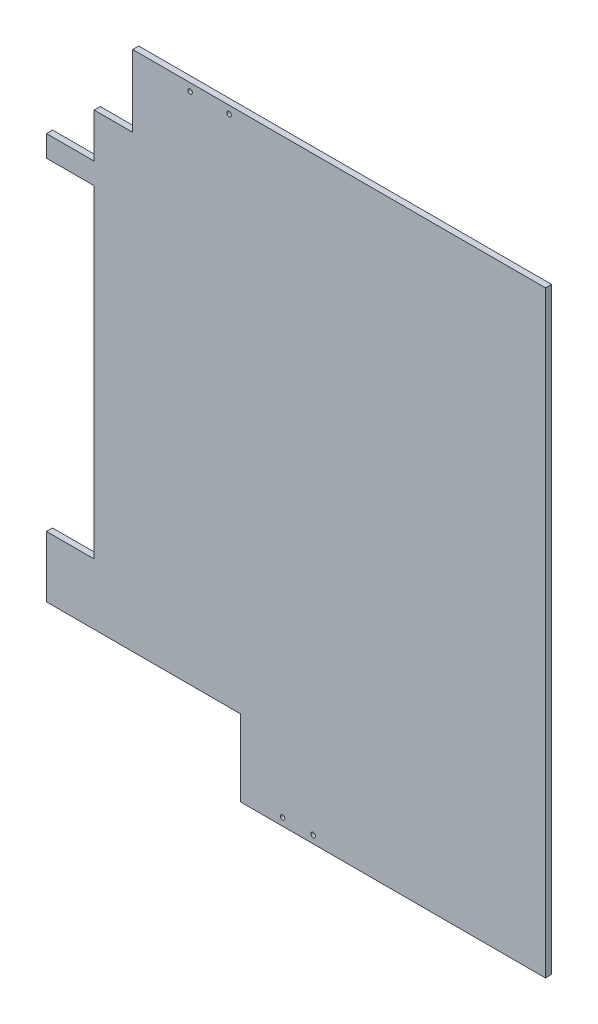
ISO-10303-21;
HEADER;
FILE_DESCRIPTION(('STEP AP214'),'2;1');
FILE_NAME('part.step','',(''),(''),'','','');
FILE_SCHEMA(('AUTOMOTIVE_DESIGN { 1 0 10303 214 1 1 1 1 }'));
ENDSEC;
DATA;
#1=APPLICATION_CONTEXT('core data for automotive mechanical design processes');
#2=APPLICATION_PROTOCOL_DEFINITION('international standard','automotive_design',2000,#1);
#3=PRODUCT_CONTEXT('',#1,'mechanical');
#4=PRODUCT('Part','Part','',(#3));
#5=PRODUCT_RELATED_PRODUCT_CATEGORY('part','',(#4));
#6=PRODUCT_DEFINITION_FORMATION('','',#4);
#7=PRODUCT_DEFINITION_CONTEXT('part definition',#1,'design');
#8=PRODUCT_DEFINITION('design','',#6,#7);
#9=PRODUCT_DEFINITION_SHAPE('','',#8);
#10=(LENGTH_UNIT() NAMED_UNIT(*) SI_UNIT(.MILLI.,.METRE.));
#11=(NAMED_UNIT(*) PLANE_ANGLE_UNIT() SI_UNIT($,.RADIAN.));
#12=(NAMED_UNIT(*) SI_UNIT($,.STERADIAN.) SOLID_ANGLE_UNIT());
#13=UNCERTAINTY_MEASURE_WITH_UNIT(LENGTH_MEASURE(1.E-05),#10,'distance_accuracy_value','');
#14=(GEOMETRIC_REPRESENTATION_CONTEXT(3) GLOBAL_UNCERTAINTY_ASSIGNED_CONTEXT((#13)) GLOBAL_UNIT_ASSIGNED_CONTEXT((#10,
#11,#12)) REPRESENTATION_CONTEXT('',''));
#15=CARTESIAN_POINT('',(0.,0.,0.));
#16=DIRECTION('',(0.,0.,1.));
#17=DIRECTION('',(1.,0.,0.));
#18=AXIS2_PLACEMENT_3D('',#15,#16,#17);
#19=CARTESIAN_POINT('',(0.,30.0000000000002,4.));
#20=DIRECTION('',(0.,1.,0.));
#21=DIRECTION('',(0.,0.,1.));
#22=AXIS2_PLACEMENT_3D('',#19,#20,#21);
#23=PLANE('',#22);
#24=DIRECTION('',(1.,0.,0.));
#25=VECTOR('',#24,1.);
#26=CARTESIAN_POINT('',(0.,30.0000000000002,0.));
#27=LINE('',#26,#25);
#28=CARTESIAN_POINT('',(25.5000000000002,30.0000000000002,0.));
#29=VERTEX_POINT('',#28);
#30=CARTESIAN_POINT('',(50.7481178591723,30.0000000000002,0.));
#31=VERTEX_POINT('',#30);
#32=EDGE_CURVE('E163',#29,#31,#27,.T.);
#33=ORIENTED_EDGE('',*,*,#32,.F.);
#34=DIRECTION('',(0.,0.,-1.));
#35=VECTOR('',#34,1.);
#36=CARTESIAN_POINT('',(25.5000000000002,30.0000000000002,4.));
#37=LINE('',#36,#35);
#38=CARTESIAN_POINT('',(25.5000000000002,30.0000000000002,4.));
#39=VERTEX_POINT('',#38);
#40=EDGE_CURVE('E11',#39,#29,#37,.T.);
#41=ORIENTED_EDGE('',*,*,#40,.F.);
#42=DIRECTION('',(1.,0.,0.));
#43=VECTOR('',#42,1.);
#44=CARTESIAN_POINT('',(0.,30.0000000000002,4.));
#45=LINE('',#44,#43);
#46=CARTESIAN_POINT('',(50.7481178591723,30.0000000000002,4.));
#47=VERTEX_POINT('',#46);
#48=EDGE_CURVE('E198',#39,#47,#45,.T.);
#49=ORIENTED_EDGE('',*,*,#48,.T.);
#50=DIRECTION('',(0.,0.,-1.));
#51=VECTOR('',#50,1.);
#52=CARTESIAN_POINT('',(50.7481178591723,30.0000000000002,4.));
#53=LINE('',#52,#51);
#54=EDGE_CURVE('E51',#47,#31,#53,.T.);
#55=ORIENTED_EDGE('',*,*,#54,.T.);
#56=EDGE_LOOP('',(#33,#41,#49,#55));
#57=FACE_BOUND('',#56,.T.);
#58=ADVANCED_FACE('F35',(#57),#23,.T.);
#59=CARTESIAN_POINT('',(25.5000000000002,0.,4.));
#60=DIRECTION('',(-1.,0.,0.));
#61=DIRECTION('',(0.,0.,1.));
#62=AXIS2_PLACEMENT_3D('',#59,#60,#61);
#63=PLANE('',#62);
#64=DIRECTION('',(0.,1.,0.));
#65=VECTOR('',#64,1.);
#66=CARTESIAN_POINT('',(25.5000000000002,0.,0.));
#67=LINE('',#66,#65);
#68=CARTESIAN_POINT('',(25.5000000000002,1.00000000000458,0.));
#69=VERTEX_POINT('',#68);
#70=EDGE_CURVE('E165',#69,#29,#67,.T.);
#71=ORIENTED_EDGE('',*,*,#70,.F.);
#72=DIRECTION('',(0.,0.,-1.));
#73=VECTOR('',#72,1.);
#74=CARTESIAN_POINT('',(25.5000000000002,1.00000000000458,4.));
#75=LINE('',#74,#73);
#76=CARTESIAN_POINT('',(25.5000000000002,1.00000000000458,4.));
#77=VERTEX_POINT('',#76);
#78=EDGE_CURVE('E43',#77,#69,#75,.T.);
#79=ORIENTED_EDGE('',*,*,#78,.F.);
#80=DIRECTION('',(0.,1.,0.));
#81=VECTOR('',#80,1.);
#82=CARTESIAN_POINT('',(25.5000000000002,0.,4.));
#83=LINE('',#82,#81);
#84=EDGE_CURVE('E251',#77,#39,#83,.T.);
#85=ORIENTED_EDGE('',*,*,#84,.T.);
#86=ORIENTED_EDGE('',*,*,#40,.T.);
#87=EDGE_LOOP('',(#71,#79,#85,#86));
#88=FACE_BOUND('',#87,.T.);
#89=ADVANCED_FACE('F229',(#88),#63,.T.);
#90=CARTESIAN_POINT('',(0.,1.00000000000458,4.));
#91=DIRECTION('',(0.,1.,0.));
#92=DIRECTION('',(0.,0.,1.));
#93=AXIS2_PLACEMENT_3D('',#90,#91,#92);
#94=PLANE('',#93);
#95=DIRECTION('',(1.,0.,0.));
#96=VECTOR('',#95,1.);
#97=CARTESIAN_POINT('',(0.,1.00000000000458,0.));
#98=LINE('',#97,#96);
#99=CARTESIAN_POINT('',(-5.78229740339875,1.00000000000458,0.));
#100=VERTEX_POINT('',#99);
#101=EDGE_CURVE('E169',#100,#69,#98,.T.);
#102=ORIENTED_EDGE('',*,*,#101,.F.);
#103=DIRECTION('',(0.,0.,-1.));
#104=VECTOR('',#103,1.);
#105=CARTESIAN_POINT('',(-5.78229740339875,1.00000000000458,4.));
#106=LINE('',#105,#104);
#107=CARTESIAN_POINT('',(-5.78229740339875,1.00000000000458,4.));
#108=VERTEX_POINT('',#107);
#109=EDGE_CURVE('E218',#108,#100,#106,.T.);
#110=ORIENTED_EDGE('',*,*,#109,.F.);
#111=DIRECTION('',(1.,0.,0.));
#112=VECTOR('',#111,1.);
#113=CARTESIAN_POINT('',(0.,1.00000000000458,4.));
#114=LINE('',#113,#112);
#115=EDGE_CURVE('E225',#108,#77,#114,.T.);
#116=ORIENTED_EDGE('',*,*,#115,.T.);
#117=ORIENTED_EDGE('',*,*,#78,.T.);
#118=EDGE_LOOP('',(#102,#110,#116,#117));
#119=FACE_BOUND('',#118,.T.);
#120=ADVANCED_FACE('F223',(#119),#94,.T.);
#121=CARTESIAN_POINT('',(-5.78229740339875,0.,4.));
#122=DIRECTION('',(1.,0.,0.));
#123=DIRECTION('',(0.,1.,0.));
#124=AXIS2_PLACEMENT_3D('',#121,#122,#123);
#125=PLANE('',#124);
#126=DIRECTION('',(0.,-1.,0.));
#127=VECTOR('',#126,1.);
#128=CARTESIAN_POINT('',(-5.78229740339875,0.,0.));
#129=LINE('',#128,#127);
#130=CARTESIAN_POINT('',(-5.78229740339875,-13.,0.));
#131=VERTEX_POINT('',#130);
#132=EDGE_CURVE('E173',#100,#131,#129,.T.);
#133=ORIENTED_EDGE('',*,*,#132,.T.);
#134=DIRECTION('',(0.,0.,-1.));
#135=VECTOR('',#134,1.);
#136=CARTESIAN_POINT('',(-5.78229740339875,-13.,4.));
#137=LINE('',#136,#135);
#138=CARTESIAN_POINT('',(-5.78229740339875,-13.,4.));
#139=VERTEX_POINT('',#138);
#140=EDGE_CURVE('E215',#139,#131,#137,.T.);
#141=ORIENTED_EDGE('',*,*,#140,.F.);
#142=DIRECTION('',(0.,-1.,0.));
#143=VECTOR('',#142,1.);
#144=CARTESIAN_POINT('',(-5.78229740339875,0.,4.));
#145=LINE('',#144,#143);
#146=EDGE_CURVE('E247',#108,#139,#145,.T.);
#147=ORIENTED_EDGE('',*,*,#146,.F.);
#148=ORIENTED_EDGE('',*,*,#109,.T.);
#149=EDGE_LOOP('',(#133,#141,#147,#148));
#150=FACE_BOUND('',#149,.T.);
#151=ADVANCED_FACE('F237',(#150),#125,.F.);
#152=CARTESIAN_POINT('',(0.,-13.,4.));
#153=DIRECTION('',(0.,1.,0.));
#154=DIRECTION('',(0.,0.,1.));
#155=AXIS2_PLACEMENT_3D('',#152,#153,#154);
#156=PLANE('',#155);
#157=DIRECTION('',(1.,0.,0.));
#158=VECTOR('',#157,1.);
#159=CARTESIAN_POINT('',(0.,-13.,0.));
#160=LINE('',#159,#158);
#161=CARTESIAN_POINT('',(25.5000000000002,-13.,0.));
#162=VERTEX_POINT('',#161);
#163=EDGE_CURVE('E175',#131,#162,#160,.T.);
#164=ORIENTED_EDGE('',*,*,#163,.T.);
#165=DIRECTION('',(0.,0.,-1.));
#166=VECTOR('',#165,1.);
#167=CARTESIAN_POINT('',(25.5000000000002,-13.,4.));
#168=LINE('',#167,#166);
#169=CARTESIAN_POINT('',(25.5000000000002,-13.,4.));
#170=VERTEX_POINT('',#169);
#171=EDGE_CURVE('E213',#170,#162,#168,.T.);
#172=ORIENTED_EDGE('',*,*,#171,.F.);
#173=DIRECTION('',(1.,0.,0.));
#174=VECTOR('',#173,1.);
#175=CARTESIAN_POINT('',(0.,-13.,4.));
#176=LINE('',#175,#174);
#177=EDGE_CURVE('E243',#139,#170,#176,.T.);
#178=ORIENTED_EDGE('',*,*,#177,.F.);
#179=ORIENTED_EDGE('',*,*,#140,.T.);
#180=EDGE_LOOP('',(#164,#172,#178,#179));
#181=FACE_BOUND('',#180,.T.);
#182=ADVANCED_FACE('F241',(#181),#156,.F.);
#183=CARTESIAN_POINT('',(25.5000000000002,-225.,0.));
#184=VERTEX_POINT('',#183);
#185=EDGE_CURVE('E170',#184,#162,#67,.T.);
#186=ORIENTED_EDGE('',*,*,#185,.F.);
#187=DIRECTION('',(0.,0.,-1.));
#188=VECTOR('',#187,1.);
#189=CARTESIAN_POINT('',(25.5000000000002,-225.,4.));
#190=LINE('',#189,#188);
#191=CARTESIAN_POINT('',(25.5000000000002,-225.,4.));
#192=VERTEX_POINT('',#191);
#193=EDGE_CURVE('E211',#192,#184,#190,.T.);
#194=ORIENTED_EDGE('',*,*,#193,.F.);
#195=EDGE_CURVE('E246',#192,#170,#83,.T.);
#196=ORIENTED_EDGE('',*,*,#195,.T.);
#197=ORIENTED_EDGE('',*,*,#171,.T.);
#198=EDGE_LOOP('',(#186,#194,#196,#197));
#199=FACE_BOUND('',#198,.T.);
#200=ADVANCED_FACE('F284',(#199),#63,.T.);
#201=CARTESIAN_POINT('',(0.,-225.,4.));
#202=DIRECTION('',(0.,1.,0.));
#203=DIRECTION('',(0.,0.,1.));
#204=AXIS2_PLACEMENT_3D('',#201,#202,#203);
#205=PLANE('',#204);
#206=DIRECTION('',(1.,0.,0.));
#207=VECTOR('',#206,1.);
#208=CARTESIAN_POINT('',(0.,-225.,0.));
#209=LINE('',#208,#207);
#210=CARTESIAN_POINT('',(-5.8245592295695,-225.,0.));
#211=VERTEX_POINT('',#210);
#212=EDGE_CURVE('E178',#211,#184,#209,.T.);
#213=ORIENTED_EDGE('',*,*,#212,.F.);
#214=DIRECTION('',(0.,0.,-1.));
#215=VECTOR('',#214,1.);
#216=CARTESIAN_POINT('',(-5.8245592295695,-225.,4.));
#217=LINE('',#216,#215);
#218=CARTESIAN_POINT('',(-5.8245592295695,-225.,4.));
#219=VERTEX_POINT('',#218);
#220=EDGE_CURVE('E209',#219,#211,#217,.T.);
#221=ORIENTED_EDGE('',*,*,#220,.F.);
#222=DIRECTION('',(1.,0.,0.));
#223=VECTOR('',#222,1.);
#224=CARTESIAN_POINT('',(0.,-225.,4.));
#225=LINE('',#224,#223);
#226=EDGE_CURVE('E249',#219,#192,#225,.T.);
#227=ORIENTED_EDGE('',*,*,#226,.T.);
#228=ORIENTED_EDGE('',*,*,#193,.T.);
#229=EDGE_LOOP('',(#213,#221,#227,#228));
#230=FACE_BOUND('',#229,.T.);
#231=ADVANCED_FACE('F291',(#230),#205,.T.);
#232=CARTESIAN_POINT('',(-5.8245592295695,0.,4.));
#233=DIRECTION('',(-1.,0.,0.));
#234=DIRECTION('',(0.,0.,1.));
#235=AXIS2_PLACEMENT_3D('',#232,#233,#234);
#236=PLANE('',#235);
#237=DIRECTION('',(0.,1.,0.));
#238=VECTOR('',#237,1.);
#239=CARTESIAN_POINT('',(-5.8245592295695,0.,0.));
#240=LINE('',#239,#238);
#241=CARTESIAN_POINT('',(-5.8245592295695,-265.,0.));
#242=VERTEX_POINT('',#241);
#243=EDGE_CURVE('E181',#242,#211,#240,.T.);
#244=ORIENTED_EDGE('',*,*,#243,.F.);
#245=DIRECTION('',(0.,0.,-1.));
#246=VECTOR('',#245,1.);
#247=CARTESIAN_POINT('',(-5.8245592295695,-265.,4.));
#248=LINE('',#247,#246);
#249=CARTESIAN_POINT('',(-5.8245592295695,-265.,4.));
#250=VERTEX_POINT('',#249);
#251=EDGE_CURVE('E207',#250,#242,#248,.T.);
#252=ORIENTED_EDGE('',*,*,#251,.F.);
#253=DIRECTION('',(0.,1.,0.));
#254=VECTOR('',#253,1.);
#255=CARTESIAN_POINT('',(-5.8245592295695,0.,4.));
#256=LINE('',#255,#254);
#257=EDGE_CURVE('E257',#250,#219,#256,.T.);
#258=ORIENTED_EDGE('',*,*,#257,.T.);
#259=ORIENTED_EDGE('',*,*,#220,.T.);
#260=EDGE_LOOP('',(#244,#252,#258,#259));
#261=FACE_BOUND('',#260,.T.);
#262=ADVANCED_FACE('F297',(#261),#236,.T.);
#263=CARTESIAN_POINT('',(0.,-265.,4.));
#264=DIRECTION('',(0.,1.,0.));
#265=DIRECTION('',(0.,0.,1.));
#266=AXIS2_PLACEMENT_3D('',#263,#264,#265);
#267=PLANE('',#266);
#268=DIRECTION('',(1.,0.,0.));
#269=VECTOR('',#268,1.);
#270=CARTESIAN_POINT('',(0.,-265.,0.));
#271=LINE('',#270,#269);
#272=CARTESIAN_POINT('',(121.5,-265.,0.));
#273=VERTEX_POINT('',#272);
#274=EDGE_CURVE('E184',#242,#273,#271,.T.);
#275=ORIENTED_EDGE('',*,*,#274,.T.);
#276=DIRECTION('',(0.,0.,-1.));
#277=VECTOR('',#276,1.);
#278=CARTESIAN_POINT('',(121.5,-265.,4.));
#279=LINE('',#278,#277);
#280=CARTESIAN_POINT('',(121.5,-265.,4.));
#281=VERTEX_POINT('',#280);
#282=EDGE_CURVE('E204',#281,#273,#279,.T.);
#283=ORIENTED_EDGE('',*,*,#282,.F.);
#284=DIRECTION('',(1.,0.,0.));
#285=VECTOR('',#284,1.);
#286=CARTESIAN_POINT('',(0.,-265.,4.));
#287=LINE('',#286,#285);
#288=EDGE_CURVE('E260',#250,#281,#287,.T.);
#289=ORIENTED_EDGE('',*,*,#288,.F.);
#290=ORIENTED_EDGE('',*,*,#251,.T.);
#291=EDGE_LOOP('',(#275,#283,#289,#290));
#292=FACE_BOUND('',#291,.T.);
#293=ADVANCED_FACE('F309',(#292),#267,.F.);
#294=CARTESIAN_POINT('',(121.5,0.,4.));
#295=DIRECTION('',(1.,0.,0.));
#296=DIRECTION('',(0.,0.,-1.));
#297=AXIS2_PLACEMENT_3D('',#294,#295,#296);
#298=PLANE('',#297);
#299=DIRECTION('',(0.,-1.,0.));
#300=VECTOR('',#299,1.);
#301=CARTESIAN_POINT('',(121.5,0.,0.));
#302=LINE('',#301,#300);
#303=CARTESIAN_POINT('',(121.5,-315.,0.));
#304=VERTEX_POINT('',#303);
#305=EDGE_CURVE('E186',#273,#304,#302,.T.);
#306=ORIENTED_EDGE('',*,*,#305,.T.);
#307=DIRECTION('',(0.,0.,-1.));
#308=VECTOR('',#307,1.);
#309=CARTESIAN_POINT('',(121.5,-315.,4.));
#310=LINE('',#309,#308);
#311=CARTESIAN_POINT('',(121.5,-315.,4.));
#312=VERTEX_POINT('',#311);
#313=EDGE_CURVE('E202',#312,#304,#310,.T.);
#314=ORIENTED_EDGE('',*,*,#313,.F.);
#315=DIRECTION('',(0.,-1.,0.));
#316=VECTOR('',#315,1.);
#317=CARTESIAN_POINT('',(121.5,0.,4.));
#318=LINE('',#317,#316);
#319=EDGE_CURVE('E262',#281,#312,#318,.T.);
#320=ORIENTED_EDGE('',*,*,#319,.F.);
#321=ORIENTED_EDGE('',*,*,#282,.T.);
#322=EDGE_LOOP('',(#306,#314,#320,#321));
#323=FACE_BOUND('',#322,.T.);
#324=ADVANCED_FACE('F312',(#323),#298,.F.);
#325=CARTESIAN_POINT('',(0.,-315.,4.));
#326=DIRECTION('',(0.,-1.,0.));
#327=DIRECTION('',(0.,0.,-1.));
#328=AXIS2_PLACEMENT_3D('',#325,#326,#327);
#329=PLANE('',#328);
#330=DIRECTION('',(-1.,0.,0.));
#331=VECTOR('',#330,1.);
#332=CARTESIAN_POINT('',(0.,-315.,0.));
#333=LINE('',#332,#331);
#334=CARTESIAN_POINT('',(321.5,-315.,0.));
#335=VERTEX_POINT('',#334);
#336=EDGE_CURVE('E189',#335,#304,#333,.T.);
#337=ORIENTED_EDGE('',*,*,#336,.F.);
#338=DIRECTION('',(0.,0.,-1.));
#339=VECTOR('',#338,1.);
#340=CARTESIAN_POINT('',(321.5,-315.,4.));
#341=LINE('',#340,#339);
#342=CARTESIAN_POINT('',(321.5,-315.,4.));
#343=VERTEX_POINT('',#342);
#344=EDGE_CURVE('E155',#343,#335,#341,.T.);
#345=ORIENTED_EDGE('',*,*,#344,.F.);
#346=DIRECTION('',(-1.,0.,0.));
#347=VECTOR('',#346,1.);
#348=CARTESIAN_POINT('',(0.,-315.,4.));
#349=LINE('',#348,#347);
#350=EDGE_CURVE('E145',#343,#312,#349,.T.);
#351=ORIENTED_EDGE('',*,*,#350,.T.);
#352=ORIENTED_EDGE('',*,*,#313,.T.);
#353=EDGE_LOOP('',(#337,#345,#351,#352));
#354=FACE_BOUND('',#353,.T.);
#355=ADVANCED_FACE('F265',(#354),#329,.T.);
#356=CARTESIAN_POINT('',(321.5,0.,4.));
#357=DIRECTION('',(-1.,0.,0.));
#358=DIRECTION('',(0.,-1.,0.));
#359=AXIS2_PLACEMENT_3D('',#356,#357,#358);
#360=PLANE('',#359);
#361=DIRECTION('',(0.,1.,0.));
#362=VECTOR('',#361,1.);
#363=CARTESIAN_POINT('',(321.5,0.,0.));
#364=LINE('',#363,#362);
#365=CARTESIAN_POINT('',(321.5,77.0000000000002,0.));
#366=VERTEX_POINT('',#365);
#367=EDGE_CURVE('E152',#335,#366,#364,.T.);
#368=ORIENTED_EDGE('',*,*,#367,.T.);
#369=DIRECTION('',(0.,0.,-1.));
#370=VECTOR('',#369,1.);
#371=CARTESIAN_POINT('',(321.5,77.0000000000002,4.));
#372=LINE('',#371,#370);
#373=CARTESIAN_POINT('',(321.5,77.0000000000002,4.));
#374=VERTEX_POINT('',#373);
#375=EDGE_CURVE('E149',#374,#366,#372,.T.);
#376=ORIENTED_EDGE('',*,*,#375,.F.);
#377=DIRECTION('',(0.,1.,0.));
#378=VECTOR('',#377,1.);
#379=CARTESIAN_POINT('',(321.5,0.,4.));
#380=LINE('',#379,#378);
#381=EDGE_CURVE('E138',#343,#374,#380,.T.);
#382=ORIENTED_EDGE('',*,*,#381,.F.);
#383=ORIENTED_EDGE('',*,*,#344,.T.);
#384=EDGE_LOOP('',(#368,#376,#382,#383));
#385=FACE_BOUND('',#384,.T.);
#386=ADVANCED_FACE('F150',(#385),#360,.F.);
#387=CARTESIAN_POINT('',(0.,77.0000000000002,4.));
#388=DIRECTION('',(0.,1.,0.));
#389=DIRECTION('',(0.,0.,1.));
#390=AXIS2_PLACEMENT_3D('',#387,#388,#389);
#391=PLANE('',#390);
#392=DIRECTION('',(1.,0.,0.));
#393=VECTOR('',#392,1.);
#394=CARTESIAN_POINT('',(0.,77.0000000000002,0.));
#395=LINE('',#394,#393);
#396=CARTESIAN_POINT('',(50.7481178591723,77.0000000000002,0.));
#397=VERTEX_POINT('',#396);
#398=EDGE_CURVE('E193',#397,#366,#395,.T.);
#399=ORIENTED_EDGE('',*,*,#398,.F.);
#400=DIRECTION('',(0.,0.,-1.));
#401=VECTOR('',#400,1.);
#402=CARTESIAN_POINT('',(50.7481178591723,77.0000000000002,4.));
#403=LINE('',#402,#401);
#404=CARTESIAN_POINT('',(50.7481178591723,77.0000000000002,4.));
#405=VERTEX_POINT('',#404);
#406=EDGE_CURVE('E94',#405,#397,#403,.T.);
#407=ORIENTED_EDGE('',*,*,#406,.F.);
#408=DIRECTION('',(1.,0.,0.));
#409=VECTOR('',#408,1.);
#410=CARTESIAN_POINT('',(0.,77.0000000000002,4.));
#411=LINE('',#410,#409);
#412=EDGE_CURVE('E143',#405,#374,#411,.T.);
#413=ORIENTED_EDGE('',*,*,#412,.T.);
#414=ORIENTED_EDGE('',*,*,#375,.T.);
#415=EDGE_LOOP('',(#399,#407,#413,#414));
#416=FACE_BOUND('',#415,.T.);
#417=ADVANCED_FACE('F157',(#416),#391,.T.);
#418=CARTESIAN_POINT('',(50.7481178591723,0.,4.));
#419=DIRECTION('',(-1.,0.,0.));
#420=DIRECTION('',(0.,0.,1.));
#421=AXIS2_PLACEMENT_3D('',#418,#419,#420);
#422=PLANE('',#421);
#423=DIRECTION('',(0.,1.,0.));
#424=VECTOR('',#423,1.);
#425=CARTESIAN_POINT('',(50.7481178591723,0.,0.));
#426=LINE('',#425,#424);
#427=EDGE_CURVE('E195',#31,#397,#426,.T.);
#428=ORIENTED_EDGE('',*,*,#427,.F.);
#429=ORIENTED_EDGE('',*,*,#54,.F.);
#430=DIRECTION('',(0.,1.,0.));
#431=VECTOR('',#430,1.);
#432=CARTESIAN_POINT('',(50.7481178591723,0.,4.));
#433=LINE('',#432,#431);
#434=EDGE_CURVE('E158',#47,#405,#433,.T.);
#435=ORIENTED_EDGE('',*,*,#434,.T.);
#436=ORIENTED_EDGE('',*,*,#406,.T.);
#437=EDGE_LOOP('',(#428,#429,#435,#436));
#438=FACE_BOUND('',#437,.T.);
#439=ADVANCED_FACE('F268',(#438),#422,.T.);
#440=CARTESIAN_POINT('',(0.,0.,4.));
#441=DIRECTION('',(0.,0.,1.));
#442=DIRECTION('',(1.,0.,0.));
#443=AXIS2_PLACEMENT_3D('',#440,#441,#442);
#444=PLANE('',#443);
#445=CARTESIAN_POINT('',(88.397045893065,71.9999999999956,4.));
#446=DIRECTION('',(0.,0.,-1.));
#447=DIRECTION('',(-1.,0.,0.));
#448=AXIS2_PLACEMENT_3D('',#445,#446,#447);
#449=CIRCLE('',#448,1.5);
#450=CARTESIAN_POINT('',(86.897045893065,71.9999999999956,4.));
#451=VERTEX_POINT('',#450);
#452=EDGE_CURVE('E427',#451,#451,#449,.T.);
#453=ORIENTED_EDGE('',*,*,#452,.T.);
#454=EDGE_LOOP('',(#453));
#455=FACE_BOUND('',#454,.T.);
#456=CARTESIAN_POINT('',(169.168895948127,-310.000000000005,4.));
#457=DIRECTION('',(0.,0.,-1.));
#458=DIRECTION('',(-1.,0.,0.));
#459=AXIS2_PLACEMENT_3D('',#456,#457,#458);
#460=CIRCLE('',#459,1.5);
#461=CARTESIAN_POINT('',(167.668895948127,-310.000000000005,4.));
#462=VERTEX_POINT('',#461);
#463=EDGE_CURVE('E431',#462,#462,#460,.T.);
#464=ORIENTED_EDGE('',*,*,#463,.T.);
#465=EDGE_LOOP('',(#464));
#466=FACE_BOUND('',#465,.T.);
#467=CARTESIAN_POINT('',(149.084447974065,-310.000000000005,4.));
#468=DIRECTION('',(0.,0.,-1.));
#469=DIRECTION('',(-1.,0.,0.));
#470=AXIS2_PLACEMENT_3D('',#467,#468,#469);
#471=CIRCLE('',#470,1.5);
#472=CARTESIAN_POINT('',(147.584447974065,-310.000000000005,4.));
#473=VERTEX_POINT('',#472);
#474=EDGE_CURVE('E442',#473,#473,#471,.T.);
#475=ORIENTED_EDGE('',*,*,#474,.T.);
#476=EDGE_LOOP('',(#475));
#477=FACE_BOUND('',#476,.T.);
#478=CARTESIAN_POINT('',(113.99838346194,71.9999999999955,4.));
#479=DIRECTION('',(0.,0.,-1.));
#480=DIRECTION('',(-1.,0.,0.));
#481=AXIS2_PLACEMENT_3D('',#478,#479,#480);
#482=CIRCLE('',#481,1.5);
#483=CARTESIAN_POINT('',(112.49838346194,71.9999999999955,4.));
#484=VERTEX_POINT('',#483);
#485=EDGE_CURVE('E166',#484,#484,#482,.T.);
#486=ORIENTED_EDGE('',*,*,#485,.T.);
#487=EDGE_LOOP('',(#486));
#488=FACE_BOUND('',#487,.T.);
#489=ORIENTED_EDGE('',*,*,#48,.F.);
#490=ORIENTED_EDGE('',*,*,#84,.F.);
#491=ORIENTED_EDGE('',*,*,#115,.F.);
#492=ORIENTED_EDGE('',*,*,#146,.T.);
#493=ORIENTED_EDGE('',*,*,#177,.T.);
#494=ORIENTED_EDGE('',*,*,#195,.F.);
#495=ORIENTED_EDGE('',*,*,#226,.F.);
#496=ORIENTED_EDGE('',*,*,#257,.F.);
#497=ORIENTED_EDGE('',*,*,#288,.T.);
#498=ORIENTED_EDGE('',*,*,#319,.T.);
#499=ORIENTED_EDGE('',*,*,#350,.F.);
#500=ORIENTED_EDGE('',*,*,#381,.T.);
#501=ORIENTED_EDGE('',*,*,#412,.F.);
#502=ORIENTED_EDGE('',*,*,#434,.F.);
#503=EDGE_LOOP('',(#489,#490,#491,#492,#493,#494,#495,#496,#497,#498,#499,#500,#501,#502));
#504=FACE_BOUND('',#503,.T.);
#505=ADVANCED_FACE('F140',(#455,#466,#477,#488,#504),#444,.T.);
#506=CARTESIAN_POINT('',(0.,0.,0.));
#507=DIRECTION('',(0.,0.,1.));
#508=DIRECTION('',(1.,0.,0.));
#509=AXIS2_PLACEMENT_3D('',#506,#507,#508);
#510=PLANE('',#509);
#511=CARTESIAN_POINT('',(88.397045893065,71.9999999999956,0.));
#512=DIRECTION('',(0.,0.,-1.));
#513=DIRECTION('',(-1.,0.,0.));
#514=AXIS2_PLACEMENT_3D('',#511,#512,#513);
#515=CIRCLE('',#514,1.5);
#516=CARTESIAN_POINT('',(86.897045893065,71.9999999999956,0.));
#517=VERTEX_POINT('',#516);
#518=EDGE_CURVE('E430',#517,#517,#515,.T.);
#519=ORIENTED_EDGE('',*,*,#518,.F.);
#520=EDGE_LOOP('',(#519));
#521=FACE_BOUND('',#520,.T.);
#522=CARTESIAN_POINT('',(169.168895948127,-310.000000000005,0.));
#523=DIRECTION('',(0.,0.,-1.));
#524=DIRECTION('',(-1.,0.,0.));
#525=AXIS2_PLACEMENT_3D('',#522,#523,#524);
#526=CIRCLE('',#525,1.5);
#527=CARTESIAN_POINT('',(167.668895948127,-310.000000000005,0.));
#528=VERTEX_POINT('',#527);
#529=EDGE_CURVE('E436',#528,#528,#526,.T.);
#530=ORIENTED_EDGE('',*,*,#529,.F.);
#531=EDGE_LOOP('',(#530));
#532=FACE_BOUND('',#531,.T.);
#533=CARTESIAN_POINT('',(149.084447974065,-310.000000000005,0.));
#534=DIRECTION('',(0.,0.,-1.));
#535=DIRECTION('',(-1.,0.,0.));
#536=AXIS2_PLACEMENT_3D('',#533,#534,#535);
#537=CIRCLE('',#536,1.5);
#538=CARTESIAN_POINT('',(147.584447974065,-310.000000000005,0.));
#539=VERTEX_POINT('',#538);
#540=EDGE_CURVE('E455',#539,#539,#537,.T.);
#541=ORIENTED_EDGE('',*,*,#540,.F.);
#542=EDGE_LOOP('',(#541));
#543=FACE_BOUND('',#542,.T.);
#544=CARTESIAN_POINT('',(113.99838346194,71.9999999999955,0.));
#545=DIRECTION('',(0.,0.,-1.));
#546=DIRECTION('',(-1.,0.,0.));
#547=AXIS2_PLACEMENT_3D('',#544,#545,#546);
#548=CIRCLE('',#547,1.5);
#549=CARTESIAN_POINT('',(112.49838346194,71.9999999999955,0.));
#550=VERTEX_POINT('',#549);
#551=EDGE_CURVE('E433',#550,#550,#548,.T.);
#552=ORIENTED_EDGE('',*,*,#551,.F.);
#553=EDGE_LOOP('',(#552));
#554=FACE_BOUND('',#553,.T.);
#555=ORIENTED_EDGE('',*,*,#32,.T.);
#556=ORIENTED_EDGE('',*,*,#427,.T.);
#557=ORIENTED_EDGE('',*,*,#398,.T.);
#558=ORIENTED_EDGE('',*,*,#367,.F.);
#559=ORIENTED_EDGE('',*,*,#336,.T.);
#560=ORIENTED_EDGE('',*,*,#305,.F.);
#561=ORIENTED_EDGE('',*,*,#274,.F.);
#562=ORIENTED_EDGE('',*,*,#243,.T.);
#563=ORIENTED_EDGE('',*,*,#212,.T.);
#564=ORIENTED_EDGE('',*,*,#185,.T.);
#565=ORIENTED_EDGE('',*,*,#163,.F.);
#566=ORIENTED_EDGE('',*,*,#132,.F.);
#567=ORIENTED_EDGE('',*,*,#101,.T.);
#568=ORIENTED_EDGE('',*,*,#70,.T.);
#569=EDGE_LOOP('',(#555,#556,#557,#558,#559,#560,#561,#562,#563,#564,#565,#566,#567,#568));
#570=FACE_BOUND('',#569,.T.);
#571=ADVANCED_FACE('F232',(#521,#532,#543,#554,#570),#510,.F.);
#572=CARTESIAN_POINT('',(113.99838346194,71.9999999999955,4.));
#573=DIRECTION('',(0.,0.,-1.));
#574=DIRECTION('',(-1.,0.,0.));
#575=AXIS2_PLACEMENT_3D('',#572,#573,#574);
#576=CYLINDRICAL_SURFACE('',#575,1.5);
#577=ORIENTED_EDGE('',*,*,#485,.F.);
#578=EDGE_LOOP('',(#577));
#579=FACE_BOUND('',#578,.T.);
#580=ORIENTED_EDGE('',*,*,#551,.T.);
#581=EDGE_LOOP('',(#580));
#582=FACE_BOUND('',#581,.T.);
#583=ADVANCED_FACE('F380',(#579,#582),#576,.F.);
#584=CARTESIAN_POINT('',(149.084447974065,-310.000000000005,4.));
#585=DIRECTION('',(0.,0.,-1.));
#586=DIRECTION('',(-1.,0.,0.));
#587=AXIS2_PLACEMENT_3D('',#584,#585,#586);
#588=CYLINDRICAL_SURFACE('',#587,1.5);
#589=ORIENTED_EDGE('',*,*,#474,.F.);
#590=EDGE_LOOP('',(#589));
#591=FACE_BOUND('',#590,.T.);
#592=ORIENTED_EDGE('',*,*,#540,.T.);
#593=EDGE_LOOP('',(#592));
#594=FACE_BOUND('',#593,.T.);
#595=ADVANCED_FACE('F390',(#591,#594),#588,.F.);
#596=CARTESIAN_POINT('',(169.168895948127,-310.000000000005,4.));
#597=DIRECTION('',(0.,0.,-1.));
#598=DIRECTION('',(-1.,0.,0.));
#599=AXIS2_PLACEMENT_3D('',#596,#597,#598);
#600=CYLINDRICAL_SURFACE('',#599,1.5);
#601=ORIENTED_EDGE('',*,*,#463,.F.);
#602=EDGE_LOOP('',(#601));
#603=FACE_BOUND('',#602,.T.);
#604=ORIENTED_EDGE('',*,*,#529,.T.);
#605=EDGE_LOOP('',(#604));
#606=FACE_BOUND('',#605,.T.);
#607=ADVANCED_FACE('F400',(#603,#606),#600,.F.);
#608=CARTESIAN_POINT('',(88.397045893065,71.9999999999956,4.));
#609=DIRECTION('',(0.,0.,-1.));
#610=DIRECTION('',(-1.,0.,0.));
#611=AXIS2_PLACEMENT_3D('',#608,#609,#610);
#612=CYLINDRICAL_SURFACE('',#611,1.5);
#613=ORIENTED_EDGE('',*,*,#452,.F.);
#614=EDGE_LOOP('',(#613));
#615=FACE_BOUND('',#614,.T.);
#616=ORIENTED_EDGE('',*,*,#518,.T.);
#617=EDGE_LOOP('',(#616));
#618=FACE_BOUND('',#617,.T.);
#619=ADVANCED_FACE('F410',(#615,#618),#612,.F.);
#620=CLOSED_SHELL('',(#58,#89,#120,#151,#182,#200,#231,#262,#293,#324,#355,#386,#417,#439,#505,
#571,#583,#595,#607,#619));
#621=MANIFOLD_SOLID_BREP('B2',#620);
#622=ADVANCED_BREP_SHAPE_REPRESENTATION('',(#18,#621),#14);
#623=SHAPE_DEFINITION_REPRESENTATION(#9,#622);
ENDSEC;
END-ISO-10303-21;
